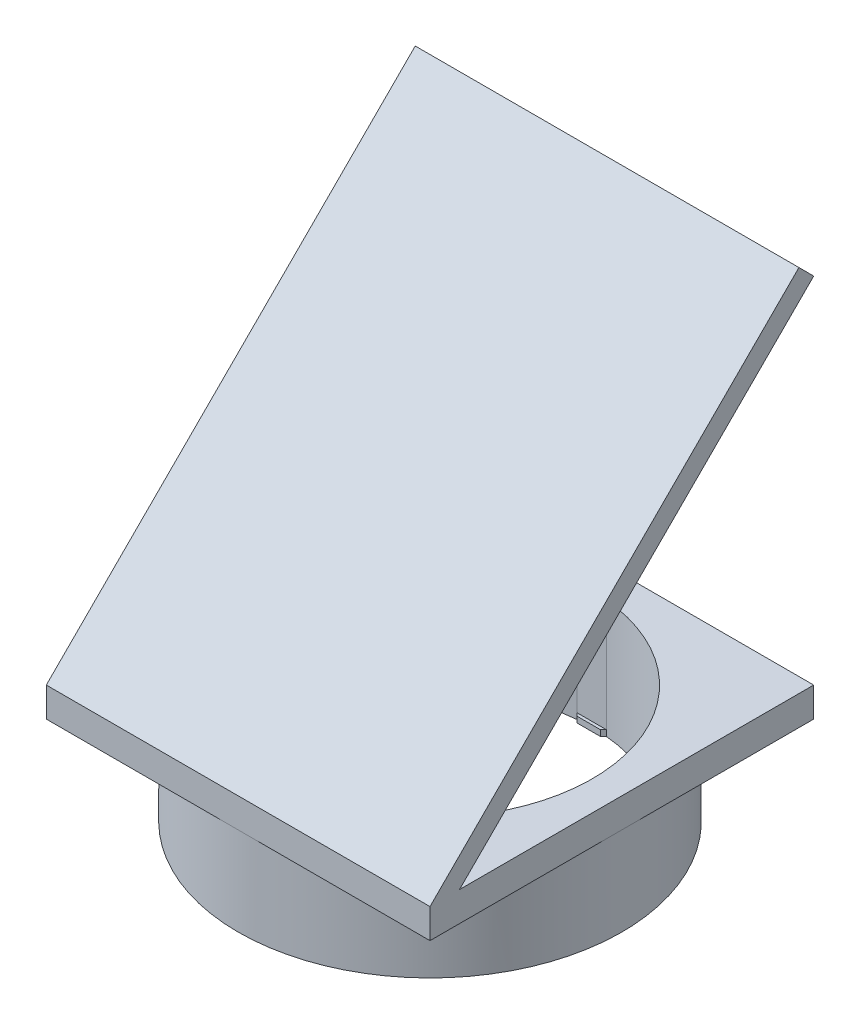
ISO-10303-21;
HEADER;
FILE_DESCRIPTION(('STEP AP214'),'2;1');
FILE_NAME('part.step','',(''),(''),'','','');
FILE_SCHEMA(('AUTOMOTIVE_DESIGN { 1 0 10303 214 1 1 1 1 }'));
ENDSEC;
DATA;
#1=APPLICATION_CONTEXT('core data for automotive mechanical design processes');
#2=APPLICATION_PROTOCOL_DEFINITION('international standard','automotive_design',2000,#1);
#3=PRODUCT_CONTEXT('',#1,'mechanical');
#4=PRODUCT('Part','Part','',(#3));
#5=PRODUCT_RELATED_PRODUCT_CATEGORY('part','',(#4));
#6=PRODUCT_DEFINITION_FORMATION('','',#4);
#7=PRODUCT_DEFINITION_CONTEXT('part definition',#1,'design');
#8=PRODUCT_DEFINITION('design','',#6,#7);
#9=PRODUCT_DEFINITION_SHAPE('','',#8);
#10=(LENGTH_UNIT() NAMED_UNIT(*) SI_UNIT(.MILLI.,.METRE.));
#11=(NAMED_UNIT(*) PLANE_ANGLE_UNIT() SI_UNIT($,.RADIAN.));
#12=(NAMED_UNIT(*) SI_UNIT($,.STERADIAN.) SOLID_ANGLE_UNIT());
#13=UNCERTAINTY_MEASURE_WITH_UNIT(LENGTH_MEASURE(1.E-05),#10,'distance_accuracy_value','');
#14=(GEOMETRIC_REPRESENTATION_CONTEXT(3) GLOBAL_UNCERTAINTY_ASSIGNED_CONTEXT((#13)) GLOBAL_UNIT_ASSIGNED_CONTEXT((#10,
#11,#12)) REPRESENTATION_CONTEXT('',''));
#15=CARTESIAN_POINT('',(0.,0.,0.));
#16=DIRECTION('',(0.,0.,1.));
#17=DIRECTION('',(1.,0.,0.));
#18=AXIS2_PLACEMENT_3D('',#15,#16,#17);
#19=CARTESIAN_POINT('',(0.,8.,0.));
#20=DIRECTION('',(0.,1.,0.));
#21=DIRECTION('',(0.,0.,1.));
#22=AXIS2_PLACEMENT_3D('',#19,#20,#21);
#23=PLANE('',#22);
#24=CARTESIAN_POINT('',(0.,8.,0.));
#25=DIRECTION('',(0.,-1.,0.));
#26=DIRECTION('',(0.,0.,-1.));
#27=AXIS2_PLACEMENT_3D('',#24,#25,#26);
#28=CIRCLE('',#27,11.);
#29=CARTESIAN_POINT('',(0.,8.,-11.));
#30=VERTEX_POINT('',#29);
#31=EDGE_CURVE('E477',#30,#30,#28,.T.);
#32=ORIENTED_EDGE('',*,*,#31,.T.);
#33=EDGE_LOOP('',(#32));
#34=FACE_BOUND('',#33,.T.);
#35=DIRECTION('',(0.,0.,1.));
#36=VECTOR('',#35,1.);
#37=CARTESIAN_POINT('',(-13.,8.,13.));
#38=LINE('',#37,#36);
#39=CARTESIAN_POINT('',(-13.,8.,-13.));
#40=VERTEX_POINT('',#39);
#41=CARTESIAN_POINT('',(-13.,8.,11.0003020228045));
#42=VERTEX_POINT('',#41);
#43=EDGE_CURVE('E237',#40,#42,#38,.T.);
#44=ORIENTED_EDGE('',*,*,#43,.T.);
#45=DIRECTION('',(1.,0.,0.));
#46=VECTOR('',#45,1.);
#47=CARTESIAN_POINT('',(-13.,8.,11.0003020228045));
#48=LINE('',#47,#46);
#49=CARTESIAN_POINT('',(13.,8.,11.0003020228045));
#50=VERTEX_POINT('',#49);
#51=EDGE_CURVE('E221',#42,#50,#48,.T.);
#52=ORIENTED_EDGE('',*,*,#51,.T.);
#53=DIRECTION('',(0.,0.,-1.));
#54=VECTOR('',#53,1.);
#55=CARTESIAN_POINT('',(13.,8.,13.));
#56=LINE('',#55,#54);
#57=CARTESIAN_POINT('',(13.,8.,-13.));
#58=VERTEX_POINT('',#57);
#59=EDGE_CURVE('E249',#50,#58,#56,.T.);
#60=ORIENTED_EDGE('',*,*,#59,.T.);
#61=DIRECTION('',(-1.,0.,0.));
#62=VECTOR('',#61,1.);
#63=CARTESIAN_POINT('',(13.,8.,-13.));
#64=LINE('',#63,#62);
#65=EDGE_CURVE('E244',#58,#40,#64,.T.);
#66=ORIENTED_EDGE('',*,*,#65,.T.);
#67=EDGE_LOOP('',(#44,#52,#60,#66));
#68=FACE_BOUND('',#67,.T.);
#69=ADVANCED_FACE('F33',(#34,#68),#23,.T.);
#70=CARTESIAN_POINT('',(10.9544511501033,6.,-0.999999999999998));
#71=DIRECTION('',(-1.,0.,0.));
#72=DIRECTION('',(0.,0.,1.));
#73=AXIS2_PLACEMENT_3D('',#70,#71,#72);
#74=PLANE('',#73);
#75=DIRECTION('',(0.,-1.,0.));
#76=VECTOR('',#75,1.);
#77=CARTESIAN_POINT('',(10.9544511501033,6.,-0.999999999999998));
#78=LINE('',#77,#76);
#79=CARTESIAN_POINT('',(10.9544511501033,6.,-1.00000000000001));
#80=VERTEX_POINT('',#79);
#81=CARTESIAN_POINT('',(10.9544511501033,0.4,-0.999999999999998));
#82=VERTEX_POINT('',#81);
#83=EDGE_CURVE('E371',#80,#82,#78,.T.);
#84=ORIENTED_EDGE('',*,*,#83,.T.);
#85=DIRECTION('',(0.,0.,-1.));
#86=VECTOR('',#85,1.);
#87=CARTESIAN_POINT('',(10.9544511501033,0.4,-1.));
#88=LINE('',#87,#86);
#89=CARTESIAN_POINT('',(10.9544511501033,0.4,0.999999999999998));
#90=VERTEX_POINT('',#89);
#91=EDGE_CURVE('E287',#90,#82,#88,.T.);
#92=ORIENTED_EDGE('',*,*,#91,.F.);
#93=DIRECTION('',(0.,-1.,0.));
#94=VECTOR('',#93,1.);
#95=CARTESIAN_POINT('',(10.9544511501033,6.,0.999999999999998));
#96=LINE('',#95,#94);
#97=CARTESIAN_POINT('',(10.9544511501033,6.,1.00000000000001));
#98=VERTEX_POINT('',#97);
#99=EDGE_CURVE('E374',#98,#90,#96,.T.);
#100=ORIENTED_EDGE('',*,*,#99,.F.);
#101=DIRECTION('',(0.,0.,-1.));
#102=VECTOR('',#101,1.);
#103=CARTESIAN_POINT('',(10.9544511501033,6.,-0.999999999999998));
#104=LINE('',#103,#102);
#105=EDGE_CURVE('E349',#98,#80,#104,.T.);
#106=ORIENTED_EDGE('',*,*,#105,.T.);
#107=EDGE_LOOP('',(#84,#92,#100,#106));
#108=FACE_BOUND('',#107,.T.);
#109=ADVANCED_FACE('F472',(#108),#74,.T.);
#110=CARTESIAN_POINT('',(1.,6.,10.9544511501033));
#111=DIRECTION('',(0.,0.,-1.));
#112=DIRECTION('',(-1.,0.,0.));
#113=AXIS2_PLACEMENT_3D('',#110,#111,#112);
#114=PLANE('',#113);
#115=DIRECTION('',(0.,-1.,0.));
#116=VECTOR('',#115,1.);
#117=CARTESIAN_POINT('',(1.,6.,10.9544511501033));
#118=LINE('',#117,#116);
#119=CARTESIAN_POINT('',(1.,6.,10.9544511501033));
#120=VERTEX_POINT('',#119);
#121=CARTESIAN_POINT('',(1.,0.4,10.9544511501033));
#122=VERTEX_POINT('',#121);
#123=EDGE_CURVE('E377',#120,#122,#118,.T.);
#124=ORIENTED_EDGE('',*,*,#123,.T.);
#125=DIRECTION('',(1.,0.,0.));
#126=VECTOR('',#125,1.);
#127=CARTESIAN_POINT('',(1.,0.4,10.9544511501033));
#128=LINE('',#127,#126);
#129=CARTESIAN_POINT('',(-1.,0.4,10.9544511501033));
#130=VERTEX_POINT('',#129);
#131=EDGE_CURVE('E302',#130,#122,#128,.T.);
#132=ORIENTED_EDGE('',*,*,#131,.F.);
#133=DIRECTION('',(0.,-1.,0.));
#134=VECTOR('',#133,1.);
#135=CARTESIAN_POINT('',(-1.,6.,10.9544511501033));
#136=LINE('',#135,#134);
#137=CARTESIAN_POINT('',(-1.00000000000001,6.,10.9544511501033));
#138=VERTEX_POINT('',#137);
#139=EDGE_CURVE('E380',#138,#130,#136,.T.);
#140=ORIENTED_EDGE('',*,*,#139,.F.);
#141=DIRECTION('',(1.,0.,0.));
#142=VECTOR('',#141,1.);
#143=CARTESIAN_POINT('',(1.,6.,10.9544511501033));
#144=LINE('',#143,#142);
#145=EDGE_CURVE('E345',#138,#120,#144,.T.);
#146=ORIENTED_EDGE('',*,*,#145,.T.);
#147=EDGE_LOOP('',(#124,#132,#140,#146));
#148=FACE_BOUND('',#147,.T.);
#149=ADVANCED_FACE('F546',(#148),#114,.T.);
#150=CARTESIAN_POINT('',(-10.9544511501033,6.,0.999999999999999));
#151=DIRECTION('',(1.,0.,0.));
#152=DIRECTION('',(0.,0.,-1.));
#153=AXIS2_PLACEMENT_3D('',#150,#151,#152);
#154=PLANE('',#153);
#155=DIRECTION('',(0.,-1.,0.));
#156=VECTOR('',#155,1.);
#157=CARTESIAN_POINT('',(-10.9544511501033,6.,0.999999999999992));
#158=LINE('',#157,#156);
#159=CARTESIAN_POINT('',(-10.9544511501033,6.,1.00000000000001));
#160=VERTEX_POINT('',#159);
#161=CARTESIAN_POINT('',(-10.9544511501033,0.4,0.999999999999992));
#162=VERTEX_POINT('',#161);
#163=EDGE_CURVE('E383',#160,#162,#158,.T.);
#164=ORIENTED_EDGE('',*,*,#163,.T.);
#165=DIRECTION('',(0.,0.,1.));
#166=VECTOR('',#165,1.);
#167=CARTESIAN_POINT('',(-10.9544511501033,0.4,1.));
#168=LINE('',#167,#166);
#169=CARTESIAN_POINT('',(-10.9544511501033,0.4,-0.999999999999999));
#170=VERTEX_POINT('',#169);
#171=EDGE_CURVE('E317',#170,#162,#168,.T.);
#172=ORIENTED_EDGE('',*,*,#171,.F.);
#173=DIRECTION('',(0.,-1.,0.));
#174=VECTOR('',#173,1.);
#175=CARTESIAN_POINT('',(-10.9544511501033,6.,-0.999999999999999));
#176=LINE('',#175,#174);
#177=CARTESIAN_POINT('',(-10.9544511501033,6.,-1.00000000000001));
#178=VERTEX_POINT('',#177);
#179=EDGE_CURVE('E386',#178,#170,#176,.T.);
#180=ORIENTED_EDGE('',*,*,#179,.F.);
#181=DIRECTION('',(0.,0.,1.));
#182=VECTOR('',#181,1.);
#183=CARTESIAN_POINT('',(-10.9544511501033,6.,0.999999999999999));
#184=LINE('',#183,#182);
#185=EDGE_CURVE('E342',#178,#160,#184,.T.);
#186=ORIENTED_EDGE('',*,*,#185,.T.);
#187=EDGE_LOOP('',(#164,#172,#180,#186));
#188=FACE_BOUND('',#187,.T.);
#189=ADVANCED_FACE('F601',(#188),#154,.T.);
#190=CARTESIAN_POINT('',(-1.,6.,-10.9544511501033));
#191=DIRECTION('',(0.,0.,1.));
#192=DIRECTION('',(1.,0.,0.));
#193=AXIS2_PLACEMENT_3D('',#190,#191,#192);
#194=PLANE('',#193);
#195=DIRECTION('',(0.,-1.,0.));
#196=VECTOR('',#195,1.);
#197=CARTESIAN_POINT('',(-1.,6.,-10.9544511501033));
#198=LINE('',#197,#196);
#199=CARTESIAN_POINT('',(-1.00000000000001,6.,-10.9544511501033));
#200=VERTEX_POINT('',#199);
#201=CARTESIAN_POINT('',(-1.,0.4,-10.9544511501033));
#202=VERTEX_POINT('',#201);
#203=EDGE_CURVE('E355',#200,#202,#198,.T.);
#204=ORIENTED_EDGE('',*,*,#203,.T.);
#205=DIRECTION('',(-1.,0.,0.));
#206=VECTOR('',#205,1.);
#207=CARTESIAN_POINT('',(-1.,0.4,-10.9544511501033));
#208=LINE('',#207,#206);
#209=CARTESIAN_POINT('',(1.,0.4,-10.9544511501033));
#210=VERTEX_POINT('',#209);
#211=EDGE_CURVE('E332',#210,#202,#208,.T.);
#212=ORIENTED_EDGE('',*,*,#211,.F.);
#213=DIRECTION('',(0.,-1.,0.));
#214=VECTOR('',#213,1.);
#215=CARTESIAN_POINT('',(1.,6.,-10.9544511501033));
#216=LINE('',#215,#214);
#217=CARTESIAN_POINT('',(1.00000000000001,6.,-10.9544511501033));
#218=VERTEX_POINT('',#217);
#219=EDGE_CURVE('E368',#218,#210,#216,.T.);
#220=ORIENTED_EDGE('',*,*,#219,.F.);
#221=DIRECTION('',(-1.,0.,0.));
#222=VECTOR('',#221,1.);
#223=CARTESIAN_POINT('',(-1.,6.,-10.9544511501033));
#224=LINE('',#223,#222);
#225=EDGE_CURVE('E352',#218,#200,#224,.T.);
#226=ORIENTED_EDGE('',*,*,#225,.T.);
#227=EDGE_LOOP('',(#204,#212,#220,#226));
#228=FACE_BOUND('',#227,.T.);
#229=ADVANCED_FACE('F622',(#228),#194,.T.);
#230=CARTESIAN_POINT('',(0.,0.,0.));
#231=DIRECTION('',(0.,1.,0.));
#232=DIRECTION('',(0.,0.,1.));
#233=AXIS2_PLACEMENT_3D('',#230,#231,#232);
#234=PLANE('',#233);
#235=CARTESIAN_POINT('',(0.,0.,0.));
#236=DIRECTION('',(0.,1.,0.));
#237=DIRECTION('',(0.,0.,1.));
#238=AXIS2_PLACEMENT_3D('',#235,#236,#237);
#239=CIRCLE('',#238,13.);
#240=CARTESIAN_POINT('',(0.,0.,13.));
#241=VERTEX_POINT('',#240);
#242=EDGE_CURVE('E389',#241,#241,#239,.T.);
#243=ORIENTED_EDGE('',*,*,#242,.F.);
#244=EDGE_LOOP('',(#243));
#245=FACE_BOUND('',#244,.T.);
#246=CARTESIAN_POINT('',(0.,0.,0.));
#247=DIRECTION('',(0.,1.,0.));
#248=DIRECTION('',(0.,0.,1.));
#249=AXIS2_PLACEMENT_3D('',#246,#247,#248);
#250=CIRCLE('',#249,11.);
#251=CARTESIAN_POINT('',(1.,0.,10.9544511501033));
#252=VERTEX_POINT('',#251);
#253=CARTESIAN_POINT('',(10.9544511501033,0.,0.999999999999998));
#254=VERTEX_POINT('',#253);
#255=EDGE_CURVE('E361',#252,#254,#250,.T.);
#256=ORIENTED_EDGE('',*,*,#255,.T.);
#257=DIRECTION('',(0.707106781186548,0.,0.707106781186548));
#258=VECTOR('',#257,1.);
#259=CARTESIAN_POINT('',(10.7544511501033,0.,0.800000000000001));
#260=LINE('',#259,#258);
#261=CARTESIAN_POINT('',(10.7544511501033,0.,0.800000000000002));
#262=VERTEX_POINT('',#261);
#263=EDGE_CURVE('E11',#254,#262,#260,.F.);
#264=ORIENTED_EDGE('',*,*,#263,.T.);
#265=DIRECTION('',(0.,0.,1.));
#266=VECTOR('',#265,1.);
#267=CARTESIAN_POINT('',(10.7544511501033,0.,-1.));
#268=LINE('',#267,#266);
#269=CARTESIAN_POINT('',(10.7544511501033,0.,-0.799999999999995));
#270=VERTEX_POINT('',#269);
#271=EDGE_CURVE('E283',#270,#262,#268,.T.);
#272=ORIENTED_EDGE('',*,*,#271,.F.);
#273=DIRECTION('',(-0.707106781186548,0.,0.707106781186548));
#274=VECTOR('',#273,1.);
#275=CARTESIAN_POINT('',(10.7544511501033,0.,-0.799999999999996));
#276=LINE('',#275,#274);
#277=CARTESIAN_POINT('',(10.9544511501033,0.,-1.));
#278=VERTEX_POINT('',#277);
#279=EDGE_CURVE('E41',#270,#278,#276,.F.);
#280=ORIENTED_EDGE('',*,*,#279,.T.);
#281=CARTESIAN_POINT('',(0.,0.,0.));
#282=DIRECTION('',(0.,1.,0.));
#283=DIRECTION('',(0.,0.,1.));
#284=AXIS2_PLACEMENT_3D('',#281,#282,#283);
#285=CIRCLE('',#284,11.);
#286=CARTESIAN_POINT('',(1.,0.,-10.9544511501033));
#287=VERTEX_POINT('',#286);
#288=EDGE_CURVE('E346',#278,#287,#285,.T.);
#289=ORIENTED_EDGE('',*,*,#288,.T.);
#290=DIRECTION('',(0.707106781186548,0.,-0.707106781186548));
#291=VECTOR('',#290,1.);
#292=CARTESIAN_POINT('',(0.799999999999999,0.,-10.7544511501033));
#293=LINE('',#292,#291);
#294=CARTESIAN_POINT('',(0.799999999999999,0.,-10.7544511501033));
#295=VERTEX_POINT('',#294);
#296=EDGE_CURVE('E416',#287,#295,#293,.F.);
#297=ORIENTED_EDGE('',*,*,#296,.T.);
#298=DIRECTION('',(1.,0.,0.));
#299=VECTOR('',#298,1.);
#300=CARTESIAN_POINT('',(-1.,0.,-10.7544511501033));
#301=LINE('',#300,#299);
#302=CARTESIAN_POINT('',(-0.799999999999999,0.,-10.7544511501033));
#303=VERTEX_POINT('',#302);
#304=EDGE_CURVE('E328',#303,#295,#301,.T.);
#305=ORIENTED_EDGE('',*,*,#304,.F.);
#306=DIRECTION('',(0.707106781186548,0.,0.707106781186548));
#307=VECTOR('',#306,1.);
#308=CARTESIAN_POINT('',(-0.799999999999999,0.,-10.7544511501033));
#309=LINE('',#308,#307);
#310=CARTESIAN_POINT('',(-1.,0.,-10.9544511501033));
#311=VERTEX_POINT('',#310);
#312=EDGE_CURVE('E414',#303,#311,#309,.F.);
#313=ORIENTED_EDGE('',*,*,#312,.T.);
#314=CARTESIAN_POINT('',(0.,0.,0.));
#315=DIRECTION('',(0.,1.,0.));
#316=DIRECTION('',(0.,0.,1.));
#317=AXIS2_PLACEMENT_3D('',#314,#315,#316);
#318=CIRCLE('',#317,11.);
#319=CARTESIAN_POINT('',(-10.9544511501033,0.,-0.999999999999999));
#320=VERTEX_POINT('',#319);
#321=EDGE_CURVE('E335',#311,#320,#318,.T.);
#322=ORIENTED_EDGE('',*,*,#321,.T.);
#323=DIRECTION('',(-0.707106781186541,0.,-0.707106781186554));
#324=VECTOR('',#323,1.);
#325=CARTESIAN_POINT('',(-10.7544511501033,0.,-0.799999999999998));
#326=LINE('',#325,#324);
#327=CARTESIAN_POINT('',(-10.7544511501033,0.,-0.799999999999998));
#328=VERTEX_POINT('',#327);
#329=EDGE_CURVE('E410',#320,#328,#326,.F.);
#330=ORIENTED_EDGE('',*,*,#329,.T.);
#331=DIRECTION('',(0.,0.,-1.));
#332=VECTOR('',#331,1.);
#333=CARTESIAN_POINT('',(-10.7544511501033,0.,1.));
#334=LINE('',#333,#332);
#335=CARTESIAN_POINT('',(-10.7544511501033,0.,0.800000000000002));
#336=VERTEX_POINT('',#335);
#337=EDGE_CURVE('E313',#336,#328,#334,.T.);
#338=ORIENTED_EDGE('',*,*,#337,.F.);
#339=DIRECTION('',(0.707106781186554,0.,-0.707106781186541));
#340=VECTOR('',#339,1.);
#341=CARTESIAN_POINT('',(-10.7544511501033,0.,0.800000000000002));
#342=LINE('',#341,#340);
#343=CARTESIAN_POINT('',(-10.9544511501033,0.,1.));
#344=VERTEX_POINT('',#343);
#345=EDGE_CURVE('E412',#336,#344,#342,.F.);
#346=ORIENTED_EDGE('',*,*,#345,.T.);
#347=CARTESIAN_POINT('',(0.,0.,0.));
#348=DIRECTION('',(0.,1.,0.));
#349=DIRECTION('',(0.,0.,1.));
#350=AXIS2_PLACEMENT_3D('',#347,#348,#349);
#351=CIRCLE('',#350,11.);
#352=CARTESIAN_POINT('',(-1.,0.,10.9544511501033));
#353=VERTEX_POINT('',#352);
#354=EDGE_CURVE('E358',#344,#353,#351,.T.);
#355=ORIENTED_EDGE('',*,*,#354,.T.);
#356=DIRECTION('',(-0.707106781186553,0.,0.707106781186542));
#357=VECTOR('',#356,1.);
#358=CARTESIAN_POINT('',(-0.799999999999997,0.,10.7544511501033));
#359=LINE('',#358,#357);
#360=CARTESIAN_POINT('',(-0.799999999999996,0.,10.7544511501033));
#361=VERTEX_POINT('',#360);
#362=EDGE_CURVE('E408',#353,#361,#359,.F.);
#363=ORIENTED_EDGE('',*,*,#362,.T.);
#364=DIRECTION('',(-1.,0.,0.));
#365=VECTOR('',#364,1.);
#366=CARTESIAN_POINT('',(1.,0.,10.7544511501033));
#367=LINE('',#366,#365);
#368=CARTESIAN_POINT('',(0.800000000000002,0.,10.7544511501033));
#369=VERTEX_POINT('',#368);
#370=EDGE_CURVE('E298',#369,#361,#367,.T.);
#371=ORIENTED_EDGE('',*,*,#370,.F.);
#372=DIRECTION('',(-0.707106781186542,0.,-0.707106781186553));
#373=VECTOR('',#372,1.);
#374=CARTESIAN_POINT('',(0.800000000000002,0.,10.7544511501033));
#375=LINE('',#374,#373);
#376=EDGE_CURVE('E406',#369,#252,#375,.F.);
#377=ORIENTED_EDGE('',*,*,#376,.T.);
#378=EDGE_LOOP('',(#256,#264,#272,#280,#289,#297,#305,#313,#322,#330,#338,#346,#355,#363,#371,#377));
#379=FACE_BOUND('',#378,.T.);
#380=ADVANCED_FACE('F450',(#245,#379),#234,.F.);
#381=CARTESIAN_POINT('',(0.,6.,0.));
#382=DIRECTION('',(0.,-1.,0.));
#383=DIRECTION('',(0.,0.,-1.));
#384=AXIS2_PLACEMENT_3D('',#381,#382,#383);
#385=CYLINDRICAL_SURFACE('',#384,13.);
#386=CARTESIAN_POINT('',(0.,6.,0.));
#387=DIRECTION('',(0.,1.,0.));
#388=DIRECTION('',(0.,0.,1.));
#389=AXIS2_PLACEMENT_3D('',#386,#387,#388);
#390=CIRCLE('',#389,13.);
#391=CARTESIAN_POINT('',(0.,6.,13.));
#392=VERTEX_POINT('',#391);
#393=CARTESIAN_POINT('',(13.,6.,0.));
#394=VERTEX_POINT('',#393);
#395=EDGE_CURVE('E390',#392,#394,#390,.T.);
#396=ORIENTED_EDGE('',*,*,#395,.F.);
#397=CARTESIAN_POINT('',(-13.,6.,0.));
#398=VERTEX_POINT('',#397);
#399=EDGE_CURVE('E56',#398,#392,#390,.T.);
#400=ORIENTED_EDGE('',*,*,#399,.F.);
#401=CARTESIAN_POINT('',(0.,6.,-13.));
#402=VERTEX_POINT('',#401);
#403=EDGE_CURVE('E526',#402,#398,#390,.T.);
#404=ORIENTED_EDGE('',*,*,#403,.F.);
#405=EDGE_CURVE('E394',#394,#402,#390,.T.);
#406=ORIENTED_EDGE('',*,*,#405,.F.);
#407=EDGE_LOOP('',(#396,#400,#404,#406));
#408=FACE_BOUND('',#407,.T.);
#409=ORIENTED_EDGE('',*,*,#242,.T.);
#410=EDGE_LOOP('',(#409));
#411=FACE_BOUND('',#410,.T.);
#412=ADVANCED_FACE('F739',(#408,#411),#385,.T.);
#413=CARTESIAN_POINT('',(0.,6.,0.));
#414=DIRECTION('',(0.,-1.,0.));
#415=DIRECTION('',(0.,0.,-1.));
#416=AXIS2_PLACEMENT_3D('',#413,#414,#415);
#417=CYLINDRICAL_SURFACE('',#416,11.);
#418=ORIENTED_EDGE('',*,*,#321,.F.);
#419=DIRECTION('',(0.,-1.,0.));
#420=VECTOR('',#419,1.);
#421=CARTESIAN_POINT('',(-1.,0.,-10.9544511501033));
#422=LINE('',#421,#420);
#423=EDGE_CURVE('E320',#202,#311,#422,.T.);
#424=ORIENTED_EDGE('',*,*,#423,.F.);
#425=ORIENTED_EDGE('',*,*,#203,.F.);
#426=CARTESIAN_POINT('',(0.,6.,0.));
#427=DIRECTION('',(0.,-1.,0.));
#428=DIRECTION('',(0.,0.,-1.));
#429=AXIS2_PLACEMENT_3D('',#426,#427,#428);
#430=CIRCLE('',#429,11.);
#431=EDGE_CURVE('E255',#200,#218,#430,.T.);
#432=ORIENTED_EDGE('',*,*,#431,.T.);
#433=ORIENTED_EDGE('',*,*,#219,.T.);
#434=DIRECTION('',(0.,1.,0.));
#435=VECTOR('',#434,1.);
#436=CARTESIAN_POINT('',(1.,0.,-10.9544511501033));
#437=LINE('',#436,#435);
#438=EDGE_CURVE('E338',#287,#210,#437,.T.);
#439=ORIENTED_EDGE('',*,*,#438,.F.);
#440=ORIENTED_EDGE('',*,*,#288,.F.);
#441=DIRECTION('',(0.,-1.,0.));
#442=VECTOR('',#441,1.);
#443=CARTESIAN_POINT('',(10.9544511501033,0.,-1.));
#444=LINE('',#443,#442);
#445=EDGE_CURVE('E282',#82,#278,#444,.T.);
#446=ORIENTED_EDGE('',*,*,#445,.F.);
#447=ORIENTED_EDGE('',*,*,#83,.F.);
#448=EDGE_CURVE('E475',#80,#98,#430,.T.);
#449=ORIENTED_EDGE('',*,*,#448,.T.);
#450=ORIENTED_EDGE('',*,*,#99,.T.);
#451=DIRECTION('',(0.,1.,0.));
#452=VECTOR('',#451,1.);
#453=CARTESIAN_POINT('',(10.9544511501033,0.,1.));
#454=LINE('',#453,#452);
#455=EDGE_CURVE('E293',#254,#90,#454,.T.);
#456=ORIENTED_EDGE('',*,*,#455,.F.);
#457=ORIENTED_EDGE('',*,*,#255,.F.);
#458=DIRECTION('',(0.,-1.,0.));
#459=VECTOR('',#458,1.);
#460=CARTESIAN_POINT('',(1.,0.,10.9544511501033));
#461=LINE('',#460,#459);
#462=EDGE_CURVE('E290',#122,#252,#461,.T.);
#463=ORIENTED_EDGE('',*,*,#462,.F.);
#464=ORIENTED_EDGE('',*,*,#123,.F.);
#465=EDGE_CURVE('E478',#120,#138,#430,.T.);
#466=ORIENTED_EDGE('',*,*,#465,.T.);
#467=ORIENTED_EDGE('',*,*,#139,.T.);
#468=DIRECTION('',(0.,1.,0.));
#469=VECTOR('',#468,1.);
#470=CARTESIAN_POINT('',(-1.,0.,10.9544511501033));
#471=LINE('',#470,#469);
#472=EDGE_CURVE('E308',#353,#130,#471,.T.);
#473=ORIENTED_EDGE('',*,*,#472,.F.);
#474=ORIENTED_EDGE('',*,*,#354,.F.);
#475=DIRECTION('',(0.,-1.,0.));
#476=VECTOR('',#475,1.);
#477=CARTESIAN_POINT('',(-10.9544511501033,0.,1.));
#478=LINE('',#477,#476);
#479=EDGE_CURVE('E305',#162,#344,#478,.T.);
#480=ORIENTED_EDGE('',*,*,#479,.F.);
#481=ORIENTED_EDGE('',*,*,#163,.F.);
#482=EDGE_CURVE('E481',#160,#178,#430,.T.);
#483=ORIENTED_EDGE('',*,*,#482,.T.);
#484=ORIENTED_EDGE('',*,*,#179,.T.);
#485=DIRECTION('',(0.,1.,0.));
#486=VECTOR('',#485,1.);
#487=CARTESIAN_POINT('',(-10.9544511501033,0.,-1.));
#488=LINE('',#487,#486);
#489=EDGE_CURVE('E323',#320,#170,#488,.T.);
#490=ORIENTED_EDGE('',*,*,#489,.F.);
#491=EDGE_LOOP('',(#418,#424,#425,#432,#433,#439,#440,#446,#447,#449,#450,#456,#457,#463,#464,
#466,#467,#473,#474,#480,#481,#483,#484,#490));
#492=FACE_BOUND('',#491,.T.);
#493=ORIENTED_EDGE('',*,*,#31,.F.);
#494=EDGE_LOOP('',(#493));
#495=FACE_BOUND('',#494,.T.);
#496=ADVANCED_FACE('F456',(#492,#495),#417,.F.);
#497=CARTESIAN_POINT('',(-1.,0.4,-10.7544511501033));
#498=DIRECTION('',(0.,-1.,0.));
#499=DIRECTION('',(1.,0.,0.));
#500=AXIS2_PLACEMENT_3D('',#497,#498,#499);
#501=PLANE('',#500);
#502=DIRECTION('',(-1.,0.,0.));
#503=VECTOR('',#502,1.);
#504=CARTESIAN_POINT('',(-1.,0.4,-10.7544511501033));
#505=LINE('',#504,#503);
#506=CARTESIAN_POINT('',(0.799999999999999,0.4,-10.7544511501033));
#507=VERTEX_POINT('',#506);
#508=CARTESIAN_POINT('',(-0.799999999999999,0.4,-10.7544511501033));
#509=VERTEX_POINT('',#508);
#510=EDGE_CURVE('E331',#507,#509,#505,.T.);
#511=ORIENTED_EDGE('',*,*,#510,.F.);
#512=DIRECTION('',(-0.707106781186548,0.,0.707106781186548));
#513=VECTOR('',#512,1.);
#514=CARTESIAN_POINT('',(0.799999999999999,0.4,-10.7544511501033));
#515=LINE('',#514,#513);
#516=EDGE_CURVE('E404',#507,#210,#515,.F.);
#517=ORIENTED_EDGE('',*,*,#516,.T.);
#518=ORIENTED_EDGE('',*,*,#211,.T.);
#519=DIRECTION('',(-0.707106781186548,0.,-0.707106781186548));
#520=VECTOR('',#519,1.);
#521=CARTESIAN_POINT('',(-0.799999999999999,0.4,-10.7544511501033));
#522=LINE('',#521,#520);
#523=EDGE_CURVE('E402',#202,#509,#522,.F.);
#524=ORIENTED_EDGE('',*,*,#523,.T.);
#525=EDGE_LOOP('',(#511,#517,#518,#524));
#526=FACE_BOUND('',#525,.T.);
#527=ADVANCED_FACE('F614',(#526),#501,.F.);
#528=CARTESIAN_POINT('',(0.,0.,-10.7544511501033));
#529=DIRECTION('',(0.,0.,-1.));
#530=DIRECTION('',(-1.,0.,0.));
#531=AXIS2_PLACEMENT_3D('',#528,#529,#530);
#532=PLANE('',#531);
#533=ORIENTED_EDGE('',*,*,#304,.T.);
#534=DIRECTION('',(0.,1.,0.));
#535=VECTOR('',#534,1.);
#536=CARTESIAN_POINT('',(0.799999999999999,0.,-10.7544511501033));
#537=LINE('',#536,#535);
#538=EDGE_CURVE('E399',#295,#507,#537,.T.);
#539=ORIENTED_EDGE('',*,*,#538,.T.);
#540=ORIENTED_EDGE('',*,*,#510,.T.);
#541=DIRECTION('',(0.,-1.,0.));
#542=VECTOR('',#541,1.);
#543=CARTESIAN_POINT('',(-0.799999999999999,0.,-10.7544511501033));
#544=LINE('',#543,#542);
#545=EDGE_CURVE('E393',#509,#303,#544,.T.);
#546=ORIENTED_EDGE('',*,*,#545,.T.);
#547=EDGE_LOOP('',(#533,#539,#540,#546));
#548=FACE_BOUND('',#547,.T.);
#549=ADVANCED_FACE('F617',(#548),#532,.F.);
#550=CARTESIAN_POINT('',(-10.7544511501033,0.4,1.));
#551=DIRECTION('',(0.,-1.,0.));
#552=DIRECTION('',(0.,0.,-1.));
#553=AXIS2_PLACEMENT_3D('',#550,#551,#552);
#554=PLANE('',#553);
#555=ORIENTED_EDGE('',*,*,#171,.T.);
#556=DIRECTION('',(-0.707106781186554,0.,0.707106781186541));
#557=VECTOR('',#556,1.);
#558=CARTESIAN_POINT('',(-10.7544511501033,0.4,0.800000000000002));
#559=LINE('',#558,#557);
#560=CARTESIAN_POINT('',(-10.7544511501033,0.4,0.800000000000002));
#561=VERTEX_POINT('',#560);
#562=EDGE_CURVE('E426',#162,#561,#559,.F.);
#563=ORIENTED_EDGE('',*,*,#562,.T.);
#564=DIRECTION('',(0.,0.,1.));
#565=VECTOR('',#564,1.);
#566=CARTESIAN_POINT('',(-10.7544511501033,0.4,1.));
#567=LINE('',#566,#565);
#568=CARTESIAN_POINT('',(-10.7544511501033,0.4,-0.799999999999998));
#569=VERTEX_POINT('',#568);
#570=EDGE_CURVE('E316',#569,#561,#567,.T.);
#571=ORIENTED_EDGE('',*,*,#570,.F.);
#572=DIRECTION('',(0.707106781186541,0.,0.707106781186554));
#573=VECTOR('',#572,1.);
#574=CARTESIAN_POINT('',(-10.7544511501033,0.4,-0.799999999999998));
#575=LINE('',#574,#573);
#576=EDGE_CURVE('E424',#569,#170,#575,.F.);
#577=ORIENTED_EDGE('',*,*,#576,.T.);
#578=EDGE_LOOP('',(#555,#563,#571,#577));
#579=FACE_BOUND('',#578,.T.);
#580=ADVANCED_FACE('F597',(#579),#554,.F.);
#581=CARTESIAN_POINT('',(-10.7544511501033,0.,-1.1193599328798E-13));
#582=DIRECTION('',(-1.,0.,0.));
#583=DIRECTION('',(0.,0.,1.));
#584=AXIS2_PLACEMENT_3D('',#581,#582,#583);
#585=PLANE('',#584);
#586=ORIENTED_EDGE('',*,*,#570,.T.);
#587=DIRECTION('',(0.,-1.,0.));
#588=VECTOR('',#587,1.);
#589=CARTESIAN_POINT('',(-10.7544511501033,0.,0.800000000000002));
#590=LINE('',#589,#588);
#591=EDGE_CURVE('E421',#561,#336,#590,.T.);
#592=ORIENTED_EDGE('',*,*,#591,.T.);
#593=ORIENTED_EDGE('',*,*,#337,.T.);
#594=DIRECTION('',(0.,1.,0.));
#595=VECTOR('',#594,1.);
#596=CARTESIAN_POINT('',(-10.7544511501033,0.,-0.799999999999998));
#597=LINE('',#596,#595);
#598=EDGE_CURVE('E418',#328,#569,#597,.T.);
#599=ORIENTED_EDGE('',*,*,#598,.T.);
#600=EDGE_LOOP('',(#586,#592,#593,#599));
#601=FACE_BOUND('',#600,.T.);
#602=ADVANCED_FACE('F593',(#601),#585,.F.);
#603=CARTESIAN_POINT('',(1.,0.4,10.7544511501033));
#604=DIRECTION('',(0.,-1.,0.));
#605=DIRECTION('',(1.,0.,0.));
#606=AXIS2_PLACEMENT_3D('',#603,#604,#605);
#607=PLANE('',#606);
#608=DIRECTION('',(1.,0.,0.));
#609=VECTOR('',#608,1.);
#610=CARTESIAN_POINT('',(1.,0.4,10.7544511501033));
#611=LINE('',#610,#609);
#612=CARTESIAN_POINT('',(-0.799999999999996,0.4,10.7544511501033));
#613=VERTEX_POINT('',#612);
#614=CARTESIAN_POINT('',(0.800000000000002,0.4,10.7544511501033));
#615=VERTEX_POINT('',#614);
#616=EDGE_CURVE('E301',#613,#615,#611,.T.);
#617=ORIENTED_EDGE('',*,*,#616,.F.);
#618=DIRECTION('',(0.707106781186553,0.,-0.707106781186542));
#619=VECTOR('',#618,1.);
#620=CARTESIAN_POINT('',(-0.799999999999997,0.4,10.7544511501033));
#621=LINE('',#620,#619);
#622=EDGE_CURVE('E436',#613,#130,#621,.F.);
#623=ORIENTED_EDGE('',*,*,#622,.T.);
#624=ORIENTED_EDGE('',*,*,#131,.T.);
#625=DIRECTION('',(0.707106781186542,0.,0.707106781186553));
#626=VECTOR('',#625,1.);
#627=CARTESIAN_POINT('',(0.800000000000002,0.4,10.7544511501033));
#628=LINE('',#627,#626);
#629=EDGE_CURVE('E434',#122,#615,#628,.F.);
#630=ORIENTED_EDGE('',*,*,#629,.T.);
#631=EDGE_LOOP('',(#617,#623,#624,#630));
#632=FACE_BOUND('',#631,.T.);
#633=ADVANCED_FACE('F578',(#632),#607,.F.);
#634=CARTESIAN_POINT('',(0.,0.,10.7544511501033));
#635=DIRECTION('',(0.,0.,1.));
#636=DIRECTION('',(1.,0.,0.));
#637=AXIS2_PLACEMENT_3D('',#634,#635,#636);
#638=PLANE('',#637);
#639=ORIENTED_EDGE('',*,*,#370,.T.);
#640=DIRECTION('',(0.,1.,0.));
#641=VECTOR('',#640,1.);
#642=CARTESIAN_POINT('',(-0.799999999999996,0.,10.7544511501033));
#643=LINE('',#642,#641);
#644=EDGE_CURVE('E431',#361,#613,#643,.T.);
#645=ORIENTED_EDGE('',*,*,#644,.T.);
#646=ORIENTED_EDGE('',*,*,#616,.T.);
#647=DIRECTION('',(0.,-1.,0.));
#648=VECTOR('',#647,1.);
#649=CARTESIAN_POINT('',(0.800000000000002,0.,10.7544511501033));
#650=LINE('',#649,#648);
#651=EDGE_CURVE('E428',#615,#369,#650,.T.);
#652=ORIENTED_EDGE('',*,*,#651,.T.);
#653=EDGE_LOOP('',(#639,#645,#646,#652));
#654=FACE_BOUND('',#653,.T.);
#655=ADVANCED_FACE('F580',(#654),#638,.F.);
#656=CARTESIAN_POINT('',(0.799999999999999,0.,-10.7544511501033));
#657=DIRECTION('',(-0.707106781186547,0.,-0.707106781186547));
#658=DIRECTION('',(0.,1.,0.));
#659=AXIS2_PLACEMENT_3D('',#656,#657,#658);
#660=PLANE('',#659);
#661=ORIENTED_EDGE('',*,*,#296,.F.);
#662=ORIENTED_EDGE('',*,*,#438,.T.);
#663=ORIENTED_EDGE('',*,*,#516,.F.);
#664=ORIENTED_EDGE('',*,*,#538,.F.);
#665=EDGE_LOOP('',(#661,#662,#663,#664));
#666=FACE_BOUND('',#665,.T.);
#667=ADVANCED_FACE('F620',(#666),#660,.F.);
#668=CARTESIAN_POINT('',(-0.799999999999999,0.,-10.7544511501033));
#669=DIRECTION('',(0.707106781186547,0.,-0.707106781186547));
#670=DIRECTION('',(0.,-1.,0.));
#671=AXIS2_PLACEMENT_3D('',#668,#669,#670);
#672=PLANE('',#671);
#673=ORIENTED_EDGE('',*,*,#523,.F.);
#674=ORIENTED_EDGE('',*,*,#423,.T.);
#675=ORIENTED_EDGE('',*,*,#312,.F.);
#676=ORIENTED_EDGE('',*,*,#545,.F.);
#677=EDGE_LOOP('',(#673,#674,#675,#676));
#678=FACE_BOUND('',#677,.T.);
#679=ADVANCED_FACE('F610',(#678),#672,.F.);
#680=CARTESIAN_POINT('',(-10.7544511501033,0.,0.800000000000002));
#681=DIRECTION('',(-0.707106781186541,0.,-0.707106781186554));
#682=DIRECTION('',(0.,-1.,0.));
#683=AXIS2_PLACEMENT_3D('',#680,#681,#682);
#684=PLANE('',#683);
#685=ORIENTED_EDGE('',*,*,#562,.F.);
#686=ORIENTED_EDGE('',*,*,#479,.T.);
#687=ORIENTED_EDGE('',*,*,#345,.F.);
#688=ORIENTED_EDGE('',*,*,#591,.F.);
#689=EDGE_LOOP('',(#685,#686,#687,#688));
#690=FACE_BOUND('',#689,.T.);
#691=ADVANCED_FACE('F591',(#690),#684,.F.);
#692=CARTESIAN_POINT('',(-10.7544511501033,0.,-0.799999999999998));
#693=DIRECTION('',(-0.707106781186554,0.,0.707106781186541));
#694=DIRECTION('',(0.,1.,0.));
#695=AXIS2_PLACEMENT_3D('',#692,#693,#694);
#696=PLANE('',#695);
#697=ORIENTED_EDGE('',*,*,#329,.F.);
#698=ORIENTED_EDGE('',*,*,#489,.T.);
#699=ORIENTED_EDGE('',*,*,#576,.F.);
#700=ORIENTED_EDGE('',*,*,#598,.F.);
#701=EDGE_LOOP('',(#697,#698,#699,#700));
#702=FACE_BOUND('',#701,.T.);
#703=ADVANCED_FACE('F605',(#702),#696,.F.);
#704=CARTESIAN_POINT('',(-0.799999999999997,0.,10.7544511501033));
#705=DIRECTION('',(0.707106781186542,0.,0.707106781186553));
#706=DIRECTION('',(0.,1.,0.));
#707=AXIS2_PLACEMENT_3D('',#704,#705,#706);
#708=PLANE('',#707);
#709=ORIENTED_EDGE('',*,*,#362,.F.);
#710=ORIENTED_EDGE('',*,*,#472,.T.);
#711=ORIENTED_EDGE('',*,*,#622,.F.);
#712=ORIENTED_EDGE('',*,*,#644,.F.);
#713=EDGE_LOOP('',(#709,#710,#711,#712));
#714=FACE_BOUND('',#713,.T.);
#715=ADVANCED_FACE('F585',(#714),#708,.F.);
#716=CARTESIAN_POINT('',(0.800000000000002,0.,10.7544511501033));
#717=DIRECTION('',(-0.707106781186553,0.,0.707106781186542));
#718=DIRECTION('',(0.,-1.,0.));
#719=AXIS2_PLACEMENT_3D('',#716,#717,#718);
#720=PLANE('',#719);
#721=ORIENTED_EDGE('',*,*,#629,.F.);
#722=ORIENTED_EDGE('',*,*,#462,.T.);
#723=ORIENTED_EDGE('',*,*,#376,.F.);
#724=ORIENTED_EDGE('',*,*,#651,.F.);
#725=EDGE_LOOP('',(#721,#722,#723,#724));
#726=FACE_BOUND('',#725,.T.);
#727=ADVANCED_FACE('F574',(#726),#720,.F.);
#728=CARTESIAN_POINT('',(10.7544511501033,0.4,-1.));
#729=DIRECTION('',(0.,-1.,0.));
#730=DIRECTION('',(0.,0.,-1.));
#731=AXIS2_PLACEMENT_3D('',#728,#729,#730);
#732=PLANE('',#731);
#733=DIRECTION('',(0.,0.,-1.));
#734=VECTOR('',#733,1.);
#735=CARTESIAN_POINT('',(10.7544511501033,0.4,-1.));
#736=LINE('',#735,#734);
#737=CARTESIAN_POINT('',(10.7544511501033,0.4,0.800000000000002));
#738=VERTEX_POINT('',#737);
#739=CARTESIAN_POINT('',(10.7544511501033,0.4,-0.799999999999995));
#740=VERTEX_POINT('',#739);
#741=EDGE_CURVE('E286',#738,#740,#736,.T.);
#742=ORIENTED_EDGE('',*,*,#741,.F.);
#743=DIRECTION('',(-0.707106781186548,0.,-0.707106781186548));
#744=VECTOR('',#743,1.);
#745=CARTESIAN_POINT('',(10.7544511501033,0.4,0.800000000000001));
#746=LINE('',#745,#744);
#747=EDGE_CURVE('E446',#738,#90,#746,.F.);
#748=ORIENTED_EDGE('',*,*,#747,.T.);
#749=ORIENTED_EDGE('',*,*,#91,.T.);
#750=DIRECTION('',(0.707106781186548,0.,-0.707106781186548));
#751=VECTOR('',#750,1.);
#752=CARTESIAN_POINT('',(10.7544511501033,0.4,-0.799999999999996));
#753=LINE('',#752,#751);
#754=EDGE_CURVE('E444',#82,#740,#753,.F.);
#755=ORIENTED_EDGE('',*,*,#754,.T.);
#756=EDGE_LOOP('',(#742,#748,#749,#755));
#757=FACE_BOUND('',#756,.T.);
#758=ADVANCED_FACE('F462',(#757),#732,.F.);
#759=CARTESIAN_POINT('',(10.7544511501033,0.,0.));
#760=DIRECTION('',(1.,0.,0.));
#761=DIRECTION('',(0.,0.,-1.));
#762=AXIS2_PLACEMENT_3D('',#759,#760,#761);
#763=PLANE('',#762);
#764=ORIENTED_EDGE('',*,*,#271,.T.);
#765=DIRECTION('',(0.,1.,0.));
#766=VECTOR('',#765,1.);
#767=CARTESIAN_POINT('',(10.7544511501033,0.,0.800000000000002));
#768=LINE('',#767,#766);
#769=EDGE_CURVE('E441',#262,#738,#768,.T.);
#770=ORIENTED_EDGE('',*,*,#769,.T.);
#771=ORIENTED_EDGE('',*,*,#741,.T.);
#772=DIRECTION('',(0.,-1.,0.));
#773=VECTOR('',#772,1.);
#774=CARTESIAN_POINT('',(10.7544511501033,0.,-0.799999999999995));
#775=LINE('',#774,#773);
#776=EDGE_CURVE('E438',#740,#270,#775,.T.);
#777=ORIENTED_EDGE('',*,*,#776,.T.);
#778=EDGE_LOOP('',(#764,#770,#771,#777));
#779=FACE_BOUND('',#778,.T.);
#780=ADVANCED_FACE('F465',(#779),#763,.F.);
#781=CARTESIAN_POINT('',(10.7544511501033,0.,0.800000000000001));
#782=DIRECTION('',(0.707106781186548,0.,-0.707106781186548));
#783=DIRECTION('',(0.,1.,0.));
#784=AXIS2_PLACEMENT_3D('',#781,#782,#783);
#785=PLANE('',#784);
#786=ORIENTED_EDGE('',*,*,#263,.F.);
#787=ORIENTED_EDGE('',*,*,#455,.T.);
#788=ORIENTED_EDGE('',*,*,#747,.F.);
#789=ORIENTED_EDGE('',*,*,#769,.F.);
#790=EDGE_LOOP('',(#786,#787,#788,#789));
#791=FACE_BOUND('',#790,.T.);
#792=ADVANCED_FACE('F469',(#791),#785,.F.);
#793=CARTESIAN_POINT('',(10.7544511501033,0.,-0.799999999999996));
#794=DIRECTION('',(0.707106781186548,0.,0.707106781186548));
#795=DIRECTION('',(0.,-1.,0.));
#796=AXIS2_PLACEMENT_3D('',#793,#794,#795);
#797=PLANE('',#796);
#798=ORIENTED_EDGE('',*,*,#754,.F.);
#799=ORIENTED_EDGE('',*,*,#445,.T.);
#800=ORIENTED_EDGE('',*,*,#279,.F.);
#801=ORIENTED_EDGE('',*,*,#776,.F.);
#802=EDGE_LOOP('',(#798,#799,#800,#801));
#803=FACE_BOUND('',#802,.T.);
#804=ADVANCED_FACE('F35',(#803),#797,.F.);
#805=CARTESIAN_POINT('',(0.,6.,0.));
#806=DIRECTION('',(0.,1.,0.));
#807=DIRECTION('',(0.,0.,1.));
#808=AXIS2_PLACEMENT_3D('',#805,#806,#807);
#809=PLANE('',#808);
#810=DIRECTION('',(1.,0.,0.));
#811=VECTOR('',#810,1.);
#812=CARTESIAN_POINT('',(13.,6.,13.));
#813=LINE('',#812,#811);
#814=CARTESIAN_POINT('',(13.,6.,13.));
#815=VERTEX_POINT('',#814);
#816=EDGE_CURVE('E263',#392,#815,#813,.T.);
#817=ORIENTED_EDGE('',*,*,#816,.F.);
#818=ORIENTED_EDGE('',*,*,#395,.T.);
#819=DIRECTION('',(0.,0.,-1.));
#820=VECTOR('',#819,1.);
#821=CARTESIAN_POINT('',(13.,6.,13.));
#822=LINE('',#821,#820);
#823=EDGE_CURVE('E269',#815,#394,#822,.T.);
#824=ORIENTED_EDGE('',*,*,#823,.F.);
#825=EDGE_LOOP('',(#817,#818,#824));
#826=FACE_BOUND('',#825,.T.);
#827=ADVANCED_FACE('F513',(#826),#809,.F.);
#828=CARTESIAN_POINT('',(13.,6.,-13.));
#829=VERTEX_POINT('',#828);
#830=EDGE_CURVE('E268',#394,#829,#822,.T.);
#831=ORIENTED_EDGE('',*,*,#830,.F.);
#832=ORIENTED_EDGE('',*,*,#405,.T.);
#833=DIRECTION('',(-1.,0.,0.));
#834=VECTOR('',#833,1.);
#835=CARTESIAN_POINT('',(13.,6.,-13.));
#836=LINE('',#835,#834);
#837=EDGE_CURVE('E247',#829,#402,#836,.T.);
#838=ORIENTED_EDGE('',*,*,#837,.F.);
#839=EDGE_LOOP('',(#831,#832,#838));
#840=FACE_BOUND('',#839,.T.);
#841=ADVANCED_FACE('F518',(#840),#809,.F.);
#842=CARTESIAN_POINT('',(-13.,6.,-13.));
#843=VERTEX_POINT('',#842);
#844=EDGE_CURVE('E252',#402,#843,#836,.T.);
#845=ORIENTED_EDGE('',*,*,#844,.F.);
#846=ORIENTED_EDGE('',*,*,#403,.T.);
#847=DIRECTION('',(0.,0.,1.));
#848=VECTOR('',#847,1.);
#849=CARTESIAN_POINT('',(-13.,6.,13.));
#850=LINE('',#849,#848);
#851=EDGE_CURVE('E261',#843,#398,#850,.T.);
#852=ORIENTED_EDGE('',*,*,#851,.F.);
#853=EDGE_LOOP('',(#845,#846,#852));
#854=FACE_BOUND('',#853,.T.);
#855=ADVANCED_FACE('F525',(#854),#809,.F.);
#856=CARTESIAN_POINT('',(-13.,6.,13.));
#857=VERTEX_POINT('',#856);
#858=EDGE_CURVE('E264',#398,#857,#850,.T.);
#859=ORIENTED_EDGE('',*,*,#858,.F.);
#860=ORIENTED_EDGE('',*,*,#399,.T.);
#861=EDGE_CURVE('E265',#857,#392,#813,.T.);
#862=ORIENTED_EDGE('',*,*,#861,.F.);
#863=EDGE_LOOP('',(#859,#860,#862));
#864=FACE_BOUND('',#863,.T.);
#865=ADVANCED_FACE('F530',(#864),#809,.F.);
#866=CARTESIAN_POINT('',(-13.,8.,13.));
#867=DIRECTION('',(1.,0.,0.));
#868=DIRECTION('',(0.,0.,-1.));
#869=AXIS2_PLACEMENT_3D('',#866,#867,#868);
#870=PLANE('',#869);
#871=ORIENTED_EDGE('',*,*,#851,.T.);
#872=ORIENTED_EDGE('',*,*,#858,.T.);
#873=DIRECTION('',(0.,-1.,0.));
#874=VECTOR('',#873,1.);
#875=CARTESIAN_POINT('',(-13.,8.,13.));
#876=LINE('',#875,#874);
#877=CARTESIAN_POINT('',(-13.,8.,13.));
#878=VERTEX_POINT('',#877);
#879=EDGE_CURVE('E279',#878,#857,#876,.T.);
#880=ORIENTED_EDGE('',*,*,#879,.F.);
#881=DIRECTION('',(0.,-0.707106781186544,0.707106781186551));
#882=VECTOR('',#881,1.);
#883=CARTESIAN_POINT('',(-13.,8.,13.));
#884=LINE('',#883,#882);
#885=CARTESIAN_POINT('',(-13.,33.000151011402,-12.0001510114022));
#886=VERTEX_POINT('',#885);
#887=EDGE_CURVE('E229',#886,#878,#884,.T.);
#888=ORIENTED_EDGE('',*,*,#887,.F.);
#889=DIRECTION('',(0.,0.707106781186551,0.707106781186544));
#890=VECTOR('',#889,1.);
#891=CARTESIAN_POINT('',(-13.,33.000151011402,-12.0001510114022));
#892=LINE('',#891,#890);
#893=CARTESIAN_POINT('',(-13.,32.0003020228042,-13.));
#894=VERTEX_POINT('',#893);
#895=EDGE_CURVE('E240',#894,#886,#892,.T.);
#896=ORIENTED_EDGE('',*,*,#895,.F.);
#897=DIRECTION('',(0.,0.707106781186544,-0.707106781186551));
#898=VECTOR('',#897,1.);
#899=CARTESIAN_POINT('',(-13.,32.0003020228042,-13.));
#900=LINE('',#899,#898);
#901=EDGE_CURVE('E224',#42,#894,#900,.T.);
#902=ORIENTED_EDGE('',*,*,#901,.F.);
#903=ORIENTED_EDGE('',*,*,#43,.F.);
#904=DIRECTION('',(0.,-1.,0.));
#905=VECTOR('',#904,1.);
#906=CARTESIAN_POINT('',(-13.,8.,-13.));
#907=LINE('',#906,#905);
#908=EDGE_CURVE('E260',#40,#843,#907,.T.);
#909=ORIENTED_EDGE('',*,*,#908,.T.);
#910=EDGE_LOOP('',(#871,#872,#880,#888,#896,#902,#903,#909));
#911=FACE_BOUND('',#910,.T.);
#912=ADVANCED_FACE('F235',(#911),#870,.F.);
#913=CARTESIAN_POINT('',(13.,8.,13.));
#914=DIRECTION('',(0.,0.,-1.));
#915=DIRECTION('',(-1.,0.,0.));
#916=AXIS2_PLACEMENT_3D('',#913,#914,#915);
#917=PLANE('',#916);
#918=ORIENTED_EDGE('',*,*,#861,.T.);
#919=ORIENTED_EDGE('',*,*,#816,.T.);
#920=DIRECTION('',(0.,-1.,0.));
#921=VECTOR('',#920,1.);
#922=CARTESIAN_POINT('',(13.,8.,13.));
#923=LINE('',#922,#921);
#924=CARTESIAN_POINT('',(13.,8.,13.));
#925=VERTEX_POINT('',#924);
#926=EDGE_CURVE('E276',#925,#815,#923,.T.);
#927=ORIENTED_EDGE('',*,*,#926,.F.);
#928=DIRECTION('',(1.,0.,0.));
#929=VECTOR('',#928,1.);
#930=CARTESIAN_POINT('',(13.,8.,13.));
#931=LINE('',#930,#929);
#932=EDGE_CURVE('E246',#878,#925,#931,.T.);
#933=ORIENTED_EDGE('',*,*,#932,.F.);
#934=ORIENTED_EDGE('',*,*,#879,.T.);
#935=EDGE_LOOP('',(#918,#919,#927,#933,#934));
#936=FACE_BOUND('',#935,.T.);
#937=ADVANCED_FACE('F507',(#936),#917,.F.);
#938=CARTESIAN_POINT('',(13.,8.,13.));
#939=DIRECTION('',(-1.,0.,0.));
#940=DIRECTION('',(0.,0.,1.));
#941=AXIS2_PLACEMENT_3D('',#938,#939,#940);
#942=PLANE('',#941);
#943=ORIENTED_EDGE('',*,*,#823,.T.);
#944=ORIENTED_EDGE('',*,*,#830,.T.);
#945=DIRECTION('',(0.,-1.,0.));
#946=VECTOR('',#945,1.);
#947=CARTESIAN_POINT('',(13.,8.,-13.));
#948=LINE('',#947,#946);
#949=EDGE_CURVE('E273',#58,#829,#948,.T.);
#950=ORIENTED_EDGE('',*,*,#949,.F.);
#951=ORIENTED_EDGE('',*,*,#59,.F.);
#952=DIRECTION('',(0.,0.707106781186544,-0.707106781186551));
#953=VECTOR('',#952,1.);
#954=CARTESIAN_POINT('',(13.,32.0003020228042,-13.));
#955=LINE('',#954,#953);
#956=CARTESIAN_POINT('',(13.,32.0003020228042,-13.));
#957=VERTEX_POINT('',#956);
#958=EDGE_CURVE('E48',#50,#957,#955,.T.);
#959=ORIENTED_EDGE('',*,*,#958,.T.);
#960=DIRECTION('',(0.,0.707106781186551,0.707106781186544));
#961=VECTOR('',#960,1.);
#962=CARTESIAN_POINT('',(13.,33.000151011402,-12.0001510114022));
#963=LINE('',#962,#961);
#964=CARTESIAN_POINT('',(13.,33.000151011402,-12.0001510114022));
#965=VERTEX_POINT('',#964);
#966=EDGE_CURVE('E495',#957,#965,#963,.T.);
#967=ORIENTED_EDGE('',*,*,#966,.T.);
#968=DIRECTION('',(0.,-0.707106781186544,0.707106781186551));
#969=VECTOR('',#968,1.);
#970=CARTESIAN_POINT('',(13.,8.,13.));
#971=LINE('',#970,#969);
#972=EDGE_CURVE('E241',#965,#925,#971,.T.);
#973=ORIENTED_EDGE('',*,*,#972,.T.);
#974=ORIENTED_EDGE('',*,*,#926,.T.);
#975=EDGE_LOOP('',(#943,#944,#950,#951,#959,#967,#973,#974));
#976=FACE_BOUND('',#975,.T.);
#977=ADVANCED_FACE('F511',(#976),#942,.F.);
#978=CARTESIAN_POINT('',(13.,8.,-13.));
#979=DIRECTION('',(0.,0.,1.));
#980=DIRECTION('',(1.,0.,0.));
#981=AXIS2_PLACEMENT_3D('',#978,#979,#980);
#982=PLANE('',#981);
#983=ORIENTED_EDGE('',*,*,#837,.T.);
#984=ORIENTED_EDGE('',*,*,#844,.T.);
#985=ORIENTED_EDGE('',*,*,#908,.F.);
#986=ORIENTED_EDGE('',*,*,#65,.F.);
#987=ORIENTED_EDGE('',*,*,#949,.T.);
#988=EDGE_LOOP('',(#983,#984,#985,#986,#987));
#989=FACE_BOUND('',#988,.T.);
#990=ADVANCED_FACE('F522',(#989),#982,.F.);
#991=CARTESIAN_POINT('',(0.,6.,0.));
#992=DIRECTION('',(0.,-1.,0.));
#993=DIRECTION('',(0.,0.,-1.));
#994=AXIS2_PLACEMENT_3D('',#991,#992,#993);
#995=PLANE('',#994);
#996=ORIENTED_EDGE('',*,*,#482,.F.);
#997=ORIENTED_EDGE('',*,*,#185,.F.);
#998=EDGE_LOOP('',(#996,#997));
#999=FACE_BOUND('',#998,.T.);
#1000=ADVANCED_FACE('F549',(#999),#995,.F.);
#1001=ORIENTED_EDGE('',*,*,#431,.F.);
#1002=ORIENTED_EDGE('',*,*,#225,.F.);
#1003=EDGE_LOOP('',(#1001,#1002));
#1004=FACE_BOUND('',#1003,.T.);
#1005=ADVANCED_FACE('F552',(#1004),#995,.F.);
#1006=ORIENTED_EDGE('',*,*,#448,.F.);
#1007=ORIENTED_EDGE('',*,*,#105,.F.);
#1008=EDGE_LOOP('',(#1006,#1007));
#1009=FACE_BOUND('',#1008,.T.);
#1010=ADVANCED_FACE('F563',(#1009),#995,.F.);
#1011=ORIENTED_EDGE('',*,*,#465,.F.);
#1012=ORIENTED_EDGE('',*,*,#145,.F.);
#1013=EDGE_LOOP('',(#1011,#1012));
#1014=FACE_BOUND('',#1013,.T.);
#1015=ADVANCED_FACE('F554',(#1014),#995,.F.);
#1016=CARTESIAN_POINT('',(-13.,8.,13.));
#1017=DIRECTION('',(0.,0.707106781186551,0.707106781186544));
#1018=DIRECTION('',(0.,-0.707106781186544,0.707106781186551));
#1019=AXIS2_PLACEMENT_3D('',#1016,#1017,#1018);
#1020=PLANE('',#1019);
#1021=ORIENTED_EDGE('',*,*,#972,.F.);
#1022=DIRECTION('',(1.,0.,0.));
#1023=VECTOR('',#1022,1.);
#1024=CARTESIAN_POINT('',(-13.,33.000151011402,-12.0001510114022));
#1025=LINE('',#1024,#1023);
#1026=EDGE_CURVE('E483',#886,#965,#1025,.T.);
#1027=ORIENTED_EDGE('',*,*,#1026,.F.);
#1028=ORIENTED_EDGE('',*,*,#887,.T.);
#1029=ORIENTED_EDGE('',*,*,#932,.T.);
#1030=EDGE_LOOP('',(#1021,#1027,#1028,#1029));
#1031=FACE_BOUND('',#1030,.T.);
#1032=ADVANCED_FACE('F504',(#1031),#1020,.T.);
#1033=CARTESIAN_POINT('',(-13.,33.000151011402,-12.0001510114022));
#1034=DIRECTION('',(0.,0.707106781186544,-0.707106781186551));
#1035=DIRECTION('',(0.,0.707106781186551,0.707106781186544));
#1036=AXIS2_PLACEMENT_3D('',#1033,#1034,#1035);
#1037=PLANE('',#1036);
#1038=ORIENTED_EDGE('',*,*,#966,.F.);
#1039=DIRECTION('',(1.,0.,0.));
#1040=VECTOR('',#1039,1.);
#1041=CARTESIAN_POINT('',(-13.,32.0003020228042,-13.));
#1042=LINE('',#1041,#1040);
#1043=EDGE_CURVE('E228',#894,#957,#1042,.T.);
#1044=ORIENTED_EDGE('',*,*,#1043,.F.);
#1045=ORIENTED_EDGE('',*,*,#895,.T.);
#1046=ORIENTED_EDGE('',*,*,#1026,.T.);
#1047=EDGE_LOOP('',(#1038,#1044,#1045,#1046));
#1048=FACE_BOUND('',#1047,.T.);
#1049=ADVANCED_FACE('F499',(#1048),#1037,.T.);
#1050=CARTESIAN_POINT('',(-13.,32.0003020228042,-13.));
#1051=DIRECTION('',(0.,-0.707106781186551,-0.707106781186544));
#1052=DIRECTION('',(0.,0.707106781186544,-0.707106781186551));
#1053=AXIS2_PLACEMENT_3D('',#1050,#1051,#1052);
#1054=PLANE('',#1053);
#1055=ORIENTED_EDGE('',*,*,#958,.F.);
#1056=ORIENTED_EDGE('',*,*,#51,.F.);
#1057=ORIENTED_EDGE('',*,*,#901,.T.);
#1058=ORIENTED_EDGE('',*,*,#1043,.T.);
#1059=EDGE_LOOP('',(#1055,#1056,#1057,#1058));
#1060=FACE_BOUND('',#1059,.T.);
#1061=ADVANCED_FACE('F223',(#1060),#1054,.T.);
#1062=CLOSED_SHELL('',(#69,#109,#149,#189,#229,#380,#412,#496,#527,#549,#580,#602,#633,#655,
#667,#679,#691,#703,#715,#727,#758,#780,#792,#804,#827,#841,#855,#865,#912,#937,#977,#990,#1000,
#1005,#1010,#1015,#1032,#1049,#1061));
#1063=MANIFOLD_SOLID_BREP('B2',#1062);
#1064=ADVANCED_BREP_SHAPE_REPRESENTATION('',(#18,#1063),#14);
#1065=SHAPE_DEFINITION_REPRESENTATION(#9,#1064);
ENDSEC;
END-ISO-10303-21;
